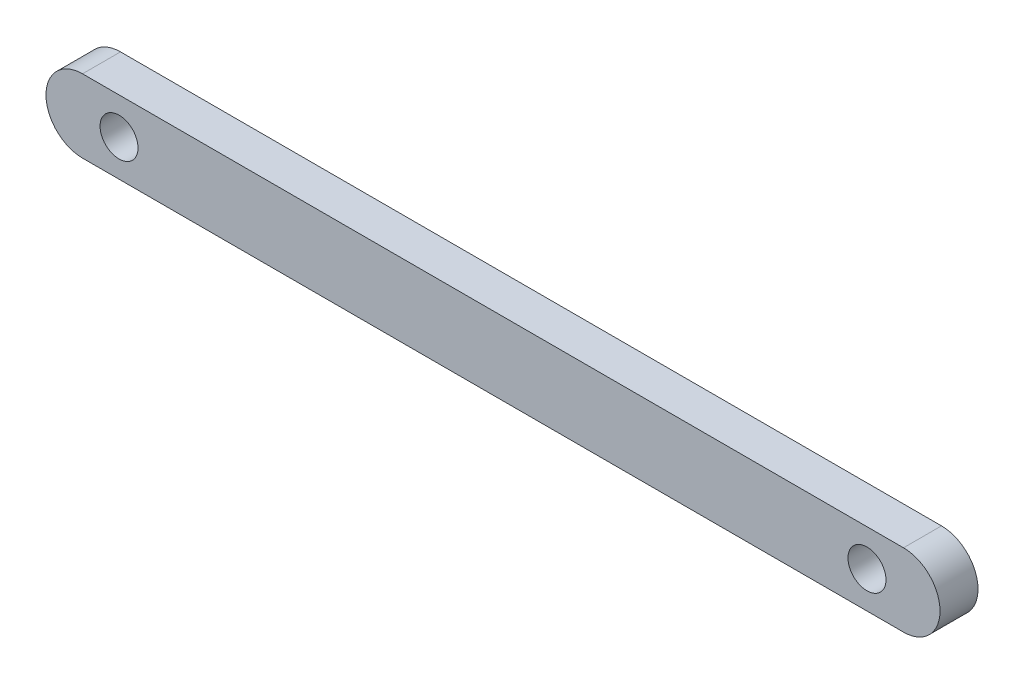
ISO-10303-21;
HEADER;
FILE_DESCRIPTION(('STEP AP214'),'2;1');
FILE_NAME('part.step','',(''),(''),'','','');
FILE_SCHEMA(('AUTOMOTIVE_DESIGN { 1 0 10303 214 1 1 1 1 }'));
ENDSEC;
DATA;
#1=APPLICATION_CONTEXT('core data for automotive mechanical design processes');
#2=APPLICATION_PROTOCOL_DEFINITION('international standard','automotive_design',2000,#1);
#3=PRODUCT_CONTEXT('',#1,'mechanical');
#4=PRODUCT('Part','Part','',(#3));
#5=PRODUCT_RELATED_PRODUCT_CATEGORY('part','',(#4));
#6=PRODUCT_DEFINITION_FORMATION('','',#4);
#7=PRODUCT_DEFINITION_CONTEXT('part definition',#1,'design');
#8=PRODUCT_DEFINITION('design','',#6,#7);
#9=PRODUCT_DEFINITION_SHAPE('','',#8);
#10=(LENGTH_UNIT() NAMED_UNIT(*) SI_UNIT(.MILLI.,.METRE.));
#11=(NAMED_UNIT(*) PLANE_ANGLE_UNIT() SI_UNIT($,.RADIAN.));
#12=(NAMED_UNIT(*) SI_UNIT($,.STERADIAN.) SOLID_ANGLE_UNIT());
#13=UNCERTAINTY_MEASURE_WITH_UNIT(LENGTH_MEASURE(1.E-05),#10,'distance_accuracy_value','');
#14=(GEOMETRIC_REPRESENTATION_CONTEXT(3) GLOBAL_UNCERTAINTY_ASSIGNED_CONTEXT((#13)) GLOBAL_UNIT_ASSIGNED_CONTEXT((#10,
#11,#12)) REPRESENTATION_CONTEXT('',''));
#15=CARTESIAN_POINT('',(0.,0.,0.));
#16=DIRECTION('',(0.,0.,1.));
#17=DIRECTION('',(1.,0.,0.));
#18=AXIS2_PLACEMENT_3D('',#15,#16,#17);
#19=CARTESIAN_POINT('',(0.,0.,3.302));
#20=DIRECTION('',(0.,0.,-1.));
#21=DIRECTION('',(-1.,0.,0.));
#22=AXIS2_PLACEMENT_3D('',#19,#20,#21);
#23=CYLINDRICAL_SURFACE('',#22,3.175);
#24=CARTESIAN_POINT('',(0.,0.,0.));
#25=DIRECTION('',(0.,0.,1.));
#26=DIRECTION('',(1.,0.,0.));
#27=AXIS2_PLACEMENT_3D('',#24,#25,#26);
#28=CIRCLE('',#27,3.175);
#29=CARTESIAN_POINT('',(0.,3.175,0.));
#30=VERTEX_POINT('',#29);
#31=CARTESIAN_POINT('',(0.,-3.175,0.));
#32=VERTEX_POINT('',#31);
#33=EDGE_CURVE('E98',#30,#32,#28,.T.);
#34=ORIENTED_EDGE('',*,*,#33,.T.);
#35=DIRECTION('',(0.,0.,-1.));
#36=VECTOR('',#35,1.);
#37=CARTESIAN_POINT('',(0.,-3.175,3.302));
#38=LINE('',#37,#36);
#39=CARTESIAN_POINT('',(0.,-3.175,3.302));
#40=VERTEX_POINT('',#39);
#41=EDGE_CURVE('E11',#40,#32,#38,.T.);
#42=ORIENTED_EDGE('',*,*,#41,.F.);
#43=CARTESIAN_POINT('',(0.,0.,3.302));
#44=DIRECTION('',(0.,0.,1.));
#45=DIRECTION('',(1.,0.,0.));
#46=AXIS2_PLACEMENT_3D('',#43,#44,#45);
#47=CIRCLE('',#46,3.175);
#48=CARTESIAN_POINT('',(0.,3.175,3.302));
#49=VERTEX_POINT('',#48);
#50=EDGE_CURVE('E86',#49,#40,#47,.T.);
#51=ORIENTED_EDGE('',*,*,#50,.F.);
#52=DIRECTION('',(0.,0.,-1.));
#53=VECTOR('',#52,1.);
#54=CARTESIAN_POINT('',(0.,3.175,3.302));
#55=LINE('',#54,#53);
#56=EDGE_CURVE('E94',#49,#30,#55,.T.);
#57=ORIENTED_EDGE('',*,*,#56,.T.);
#58=EDGE_LOOP('',(#34,#42,#51,#57));
#59=FACE_BOUND('',#58,.T.);
#60=ADVANCED_FACE('F35',(#59),#23,.T.);
#61=CARTESIAN_POINT('',(0.,-3.175,3.302));
#62=DIRECTION('',(0.,1.,0.));
#63=DIRECTION('',(0.,0.,1.));
#64=AXIS2_PLACEMENT_3D('',#61,#62,#63);
#65=PLANE('',#64);
#66=DIRECTION('',(1.,0.,0.));
#67=VECTOR('',#66,1.);
#68=CARTESIAN_POINT('',(0.,-3.175,0.));
#69=LINE('',#68,#67);
#70=CARTESIAN_POINT('',(71.374,-3.175,0.));
#71=VERTEX_POINT('',#70);
#72=EDGE_CURVE('E90',#32,#71,#69,.T.);
#73=ORIENTED_EDGE('',*,*,#72,.T.);
#74=DIRECTION('',(0.,0.,-1.));
#75=VECTOR('',#74,1.);
#76=CARTESIAN_POINT('',(71.374,-3.175,3.302));
#77=LINE('',#76,#75);
#78=CARTESIAN_POINT('',(71.374,-3.175,3.302));
#79=VERTEX_POINT('',#78);
#80=EDGE_CURVE('E43',#79,#71,#77,.T.);
#81=ORIENTED_EDGE('',*,*,#80,.F.);
#82=DIRECTION('',(1.,0.,0.));
#83=VECTOR('',#82,1.);
#84=CARTESIAN_POINT('',(0.,-3.175,3.302));
#85=LINE('',#84,#83);
#86=EDGE_CURVE('E81',#40,#79,#85,.T.);
#87=ORIENTED_EDGE('',*,*,#86,.F.);
#88=ORIENTED_EDGE('',*,*,#41,.T.);
#89=EDGE_LOOP('',(#73,#81,#87,#88));
#90=FACE_BOUND('',#89,.T.);
#91=ADVANCED_FACE('F89',(#90),#65,.F.);
#92=CARTESIAN_POINT('',(71.374,0.,3.302));
#93=DIRECTION('',(0.,0.,-1.));
#94=DIRECTION('',(-1.,0.,0.));
#95=AXIS2_PLACEMENT_3D('',#92,#93,#94);
#96=CYLINDRICAL_SURFACE('',#95,3.175);
#97=CARTESIAN_POINT('',(71.374,0.,0.));
#98=DIRECTION('',(0.,0.,1.));
#99=DIRECTION('',(1.,0.,0.));
#100=AXIS2_PLACEMENT_3D('',#97,#98,#99);
#101=CIRCLE('',#100,3.175);
#102=CARTESIAN_POINT('',(71.374,3.175,0.));
#103=VERTEX_POINT('',#102);
#104=EDGE_CURVE('E68',#71,#103,#101,.T.);
#105=ORIENTED_EDGE('',*,*,#104,.T.);
#106=DIRECTION('',(0.,0.,-1.));
#107=VECTOR('',#106,1.);
#108=CARTESIAN_POINT('',(71.374,3.175,3.302));
#109=LINE('',#108,#107);
#110=CARTESIAN_POINT('',(71.374,3.175,3.302));
#111=VERTEX_POINT('',#110);
#112=EDGE_CURVE('E91',#111,#103,#109,.T.);
#113=ORIENTED_EDGE('',*,*,#112,.F.);
#114=CARTESIAN_POINT('',(71.374,0.,3.302));
#115=DIRECTION('',(0.,0.,1.));
#116=DIRECTION('',(1.,0.,0.));
#117=AXIS2_PLACEMENT_3D('',#114,#115,#116);
#118=CIRCLE('',#117,3.175);
#119=EDGE_CURVE('E84',#79,#111,#118,.T.);
#120=ORIENTED_EDGE('',*,*,#119,.F.);
#121=ORIENTED_EDGE('',*,*,#80,.T.);
#122=EDGE_LOOP('',(#105,#113,#120,#121));
#123=FACE_BOUND('',#122,.T.);
#124=ADVANCED_FACE('F92',(#123),#96,.T.);
#125=CARTESIAN_POINT('',(0.,3.175,3.302));
#126=DIRECTION('',(0.,-1.,0.));
#127=DIRECTION('',(0.,0.,-1.));
#128=AXIS2_PLACEMENT_3D('',#125,#126,#127);
#129=PLANE('',#128);
#130=DIRECTION('',(-1.,0.,0.));
#131=VECTOR('',#130,1.);
#132=CARTESIAN_POINT('',(0.,3.175,0.));
#133=LINE('',#132,#131);
#134=EDGE_CURVE('E74',#103,#30,#133,.T.);
#135=ORIENTED_EDGE('',*,*,#134,.T.);
#136=ORIENTED_EDGE('',*,*,#56,.F.);
#137=DIRECTION('',(-1.,0.,0.));
#138=VECTOR('',#137,1.);
#139=CARTESIAN_POINT('',(0.,3.175,3.302));
#140=LINE('',#139,#138);
#141=EDGE_CURVE('E51',#111,#49,#140,.T.);
#142=ORIENTED_EDGE('',*,*,#141,.F.);
#143=ORIENTED_EDGE('',*,*,#112,.T.);
#144=EDGE_LOOP('',(#135,#136,#142,#143));
#145=FACE_BOUND('',#144,.T.);
#146=ADVANCED_FACE('F106',(#145),#129,.F.);
#147=CARTESIAN_POINT('',(0.,0.,3.302));
#148=DIRECTION('',(0.,0.,1.));
#149=DIRECTION('',(1.,0.,0.));
#150=AXIS2_PLACEMENT_3D('',#147,#148,#149);
#151=PLANE('',#150);
#152=CARTESIAN_POINT('',(3.175,0.,3.302));
#153=DIRECTION('',(0.,0.,1.));
#154=DIRECTION('',(1.,0.,0.));
#155=AXIS2_PLACEMENT_3D('',#152,#153,#154);
#156=CIRCLE('',#155,1.65099999999999);
#157=CARTESIAN_POINT('',(4.82599999999999,0.,3.302));
#158=VERTEX_POINT('',#157);
#159=EDGE_CURVE('E120',#158,#158,#156,.T.);
#160=ORIENTED_EDGE('',*,*,#159,.F.);
#161=EDGE_LOOP('',(#160));
#162=FACE_BOUND('',#161,.T.);
#163=CARTESIAN_POINT('',(68.199,0.,3.302));
#164=DIRECTION('',(0.,0.,1.));
#165=DIRECTION('',(1.,0.,0.));
#166=AXIS2_PLACEMENT_3D('',#163,#164,#165);
#167=CIRCLE('',#166,1.65099999999999);
#168=CARTESIAN_POINT('',(69.85,0.,3.302));
#169=VERTEX_POINT('',#168);
#170=EDGE_CURVE('E114',#169,#169,#167,.T.);
#171=ORIENTED_EDGE('',*,*,#170,.F.);
#172=EDGE_LOOP('',(#171));
#173=FACE_BOUND('',#172,.T.);
#174=ORIENTED_EDGE('',*,*,#50,.T.);
#175=ORIENTED_EDGE('',*,*,#86,.T.);
#176=ORIENTED_EDGE('',*,*,#119,.T.);
#177=ORIENTED_EDGE('',*,*,#141,.T.);
#178=EDGE_LOOP('',(#174,#175,#176,#177));
#179=FACE_BOUND('',#178,.T.);
#180=ADVANCED_FACE('F82',(#162,#173,#179),#151,.T.);
#181=CARTESIAN_POINT('',(0.,0.,0.));
#182=DIRECTION('',(0.,0.,1.));
#183=DIRECTION('',(1.,0.,0.));
#184=AXIS2_PLACEMENT_3D('',#181,#182,#183);
#185=PLANE('',#184);
#186=CARTESIAN_POINT('',(3.175,0.,0.));
#187=DIRECTION('',(0.,0.,1.));
#188=DIRECTION('',(1.,0.,0.));
#189=AXIS2_PLACEMENT_3D('',#186,#187,#188);
#190=CIRCLE('',#189,1.651);
#191=CARTESIAN_POINT('',(4.826,0.,0.));
#192=VERTEX_POINT('',#191);
#193=EDGE_CURVE('E117',#192,#192,#190,.T.);
#194=ORIENTED_EDGE('',*,*,#193,.T.);
#195=EDGE_LOOP('',(#194));
#196=FACE_BOUND('',#195,.T.);
#197=CARTESIAN_POINT('',(68.199,0.,0.));
#198=DIRECTION('',(0.,0.,1.));
#199=DIRECTION('',(1.,0.,0.));
#200=AXIS2_PLACEMENT_3D('',#197,#198,#199);
#201=CIRCLE('',#200,1.651);
#202=CARTESIAN_POINT('',(69.85,0.,0.));
#203=VERTEX_POINT('',#202);
#204=EDGE_CURVE('E101',#203,#203,#201,.T.);
#205=ORIENTED_EDGE('',*,*,#204,.T.);
#206=EDGE_LOOP('',(#205));
#207=FACE_BOUND('',#206,.T.);
#208=ORIENTED_EDGE('',*,*,#33,.F.);
#209=ORIENTED_EDGE('',*,*,#134,.F.);
#210=ORIENTED_EDGE('',*,*,#104,.F.);
#211=ORIENTED_EDGE('',*,*,#72,.F.);
#212=EDGE_LOOP('',(#208,#209,#210,#211));
#213=FACE_BOUND('',#212,.T.);
#214=ADVANCED_FACE('F109',(#196,#207,#213),#185,.F.);
#215=CARTESIAN_POINT('',(68.199,0.,3.302));
#216=DIRECTION('',(0.,0.,1.));
#217=DIRECTION('',(1.,0.,0.));
#218=AXIS2_PLACEMENT_3D('',#215,#216,#217);
#219=CYLINDRICAL_SURFACE('',#218,1.65099999999999);
#220=ORIENTED_EDGE('',*,*,#204,.F.);
#221=EDGE_LOOP('',(#220));
#222=FACE_BOUND('',#221,.T.);
#223=ORIENTED_EDGE('',*,*,#170,.T.);
#224=EDGE_LOOP('',(#223));
#225=FACE_BOUND('',#224,.T.);
#226=ADVANCED_FACE('F131',(#222,#225),#219,.F.);
#227=CARTESIAN_POINT('',(3.175,0.,3.302));
#228=DIRECTION('',(0.,0.,1.));
#229=DIRECTION('',(1.,0.,0.));
#230=AXIS2_PLACEMENT_3D('',#227,#228,#229);
#231=CYLINDRICAL_SURFACE('',#230,1.65099999999999);
#232=ORIENTED_EDGE('',*,*,#193,.F.);
#233=EDGE_LOOP('',(#232));
#234=FACE_BOUND('',#233,.T.);
#235=ORIENTED_EDGE('',*,*,#159,.T.);
#236=EDGE_LOOP('',(#235));
#237=FACE_BOUND('',#236,.T.);
#238=ADVANCED_FACE('F124',(#234,#237),#231,.F.);
#239=CLOSED_SHELL('',(#60,#91,#124,#146,#180,#214,#226,#238));
#240=MANIFOLD_SOLID_BREP('B2',#239);
#241=ADVANCED_BREP_SHAPE_REPRESENTATION('',(#18,#240),#14);
#242=SHAPE_DEFINITION_REPRESENTATION(#9,#241);
ENDSEC;
END-ISO-10303-21;
